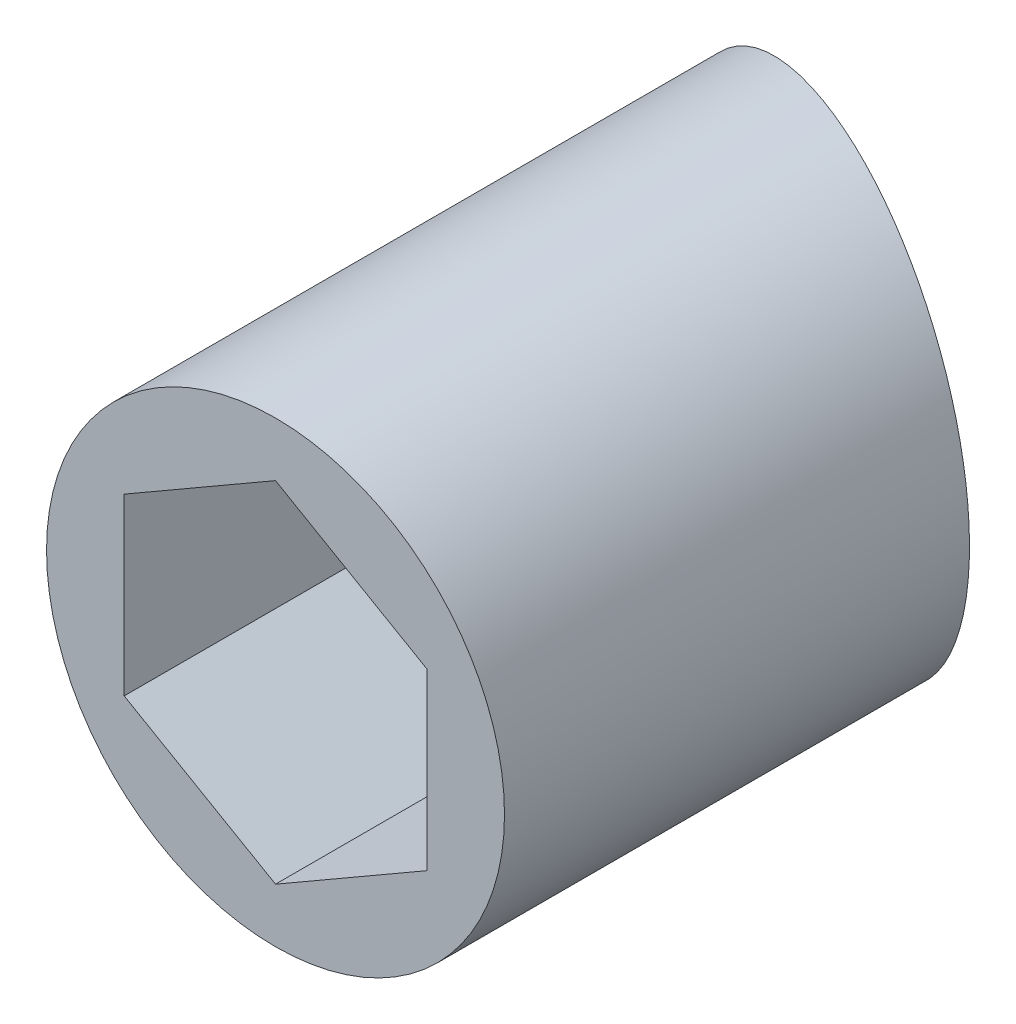
ISO-10303-21;
HEADER;
FILE_DESCRIPTION(('STEP AP214'),'2;1');
FILE_NAME('part.step','',(''),(''),'','','');
FILE_SCHEMA(('AUTOMOTIVE_DESIGN { 1 0 10303 214 1 1 1 1 }'));
ENDSEC;
DATA;
#1=APPLICATION_CONTEXT('core data for automotive mechanical design processes');
#2=APPLICATION_PROTOCOL_DEFINITION('international standard','automotive_design',2000,#1);
#3=PRODUCT_CONTEXT('',#1,'mechanical');
#4=PRODUCT('Part','Part','',(#3));
#5=PRODUCT_RELATED_PRODUCT_CATEGORY('part','',(#4));
#6=PRODUCT_DEFINITION_FORMATION('','',#4);
#7=PRODUCT_DEFINITION_CONTEXT('part definition',#1,'design');
#8=PRODUCT_DEFINITION('design','',#6,#7);
#9=PRODUCT_DEFINITION_SHAPE('','',#8);
#10=(LENGTH_UNIT() NAMED_UNIT(*) SI_UNIT(.MILLI.,.METRE.));
#11=(NAMED_UNIT(*) PLANE_ANGLE_UNIT() SI_UNIT($,.RADIAN.));
#12=(NAMED_UNIT(*) SI_UNIT($,.STERADIAN.) SOLID_ANGLE_UNIT());
#13=UNCERTAINTY_MEASURE_WITH_UNIT(LENGTH_MEASURE(1.E-05),#10,'distance_accuracy_value','');
#14=(GEOMETRIC_REPRESENTATION_CONTEXT(3) GLOBAL_UNCERTAINTY_ASSIGNED_CONTEXT((#13)) GLOBAL_UNIT_ASSIGNED_CONTEXT((#10,
#11,#12)) REPRESENTATION_CONTEXT('',''));
#15=CARTESIAN_POINT('',(0.,0.,0.));
#16=DIRECTION('',(0.,0.,1.));
#17=DIRECTION('',(1.,0.,0.));
#18=AXIS2_PLACEMENT_3D('',#15,#16,#17);
#19=CARTESIAN_POINT('',(0.,0.,12.));
#20=DIRECTION('',(0.,0.,-1.));
#21=DIRECTION('',(-1.,0.,0.));
#22=AXIS2_PLACEMENT_3D('',#19,#20,#21);
#23=CYLINDRICAL_SURFACE('',#22,4.35);
#24=CARTESIAN_POINT('',(0.,0.,12.));
#25=DIRECTION('',(0.,0.,1.));
#26=DIRECTION('',(1.,0.,0.));
#27=AXIS2_PLACEMENT_3D('',#24,#25,#26);
#28=CIRCLE('',#27,4.35);
#29=CARTESIAN_POINT('',(4.35,0.,12.));
#30=VERTEX_POINT('',#29);
#31=EDGE_CURVE('E11',#30,#30,#28,.T.);
#32=ORIENTED_EDGE('',*,*,#31,.F.);
#33=EDGE_LOOP('',(#32));
#34=FACE_BOUND('',#33,.T.);
#35=CARTESIAN_POINT('',(0.,0.,1.58327051905795));
#36=DIRECTION('',(0.342020143325663,0.,-0.939692620785911));
#37=DIRECTION('',(-0.939692620785911,0.,-0.342020143325663));
#38=AXIS2_PLACEMENT_3D('',#35,#36,#37);
#39=ELLIPSE('',#38,4.62917331027021,4.35);
#40=CARTESIAN_POINT('',(-4.35,0.,0.));
#41=VERTEX_POINT('',#40);
#42=EDGE_CURVE('E123',#41,#41,#39,.F.);
#43=ORIENTED_EDGE('',*,*,#42,.T.);
#44=EDGE_LOOP('',(#43));
#45=FACE_BOUND('',#44,.T.);
#46=ADVANCED_FACE('F35',(#34,#45),#23,.T.);
#47=CARTESIAN_POINT('',(0.,0.,12.));
#48=DIRECTION('',(0.,0.,1.));
#49=DIRECTION('',(1.,0.,0.));
#50=AXIS2_PLACEMENT_3D('',#47,#48,#49);
#51=PLANE('',#50);
#52=DIRECTION('',(-0.866025403784439,0.5,0.));
#53=VECTOR('',#52,1.);
#54=CARTESIAN_POINT('',(2.875,1.65988202392018,12.));
#55=LINE('',#54,#53);
#56=CARTESIAN_POINT('',(2.875,1.65988202392018,12.));
#57=VERTEX_POINT('',#56);
#58=CARTESIAN_POINT('',(0.,3.31976404784035,12.));
#59=VERTEX_POINT('',#58);
#60=EDGE_CURVE('E49',#57,#59,#55,.T.);
#61=ORIENTED_EDGE('',*,*,#60,.F.);
#62=DIRECTION('',(0.,1.,0.));
#63=VECTOR('',#62,1.);
#64=CARTESIAN_POINT('',(2.875,-1.65988202392018,12.));
#65=LINE('',#64,#63);
#66=CARTESIAN_POINT('',(2.875,-1.65988202392018,12.));
#67=VERTEX_POINT('',#66);
#68=EDGE_CURVE('E132',#67,#57,#65,.T.);
#69=ORIENTED_EDGE('',*,*,#68,.F.);
#70=DIRECTION('',(0.866025403784439,0.5,0.));
#71=VECTOR('',#70,1.);
#72=CARTESIAN_POINT('',(0.,-3.31976404784035,12.));
#73=LINE('',#72,#71);
#74=CARTESIAN_POINT('',(0.,-3.31976404784035,12.));
#75=VERTEX_POINT('',#74);
#76=EDGE_CURVE('E130',#75,#67,#73,.T.);
#77=ORIENTED_EDGE('',*,*,#76,.F.);
#78=DIRECTION('',(0.866025403784439,-0.5,0.));
#79=VECTOR('',#78,1.);
#80=CARTESIAN_POINT('',(-2.875,-1.65988202392017,12.));
#81=LINE('',#80,#79);
#82=CARTESIAN_POINT('',(-2.875,-1.65988202392017,12.));
#83=VERTEX_POINT('',#82);
#84=EDGE_CURVE('E96',#83,#75,#81,.T.);
#85=ORIENTED_EDGE('',*,*,#84,.F.);
#86=DIRECTION('',(0.,-1.,0.));
#87=VECTOR('',#86,1.);
#88=CARTESIAN_POINT('',(-2.875,1.65988202392018,12.));
#89=LINE('',#88,#87);
#90=CARTESIAN_POINT('',(-2.875,1.65988202392018,12.));
#91=VERTEX_POINT('',#90);
#92=EDGE_CURVE('E126',#91,#83,#89,.T.);
#93=ORIENTED_EDGE('',*,*,#92,.F.);
#94=DIRECTION('',(-0.866025403784439,-0.5,0.));
#95=VECTOR('',#94,1.);
#96=CARTESIAN_POINT('',(0.,3.31976404784035,12.));
#97=LINE('',#96,#95);
#98=EDGE_CURVE('E122',#59,#91,#97,.T.);
#99=ORIENTED_EDGE('',*,*,#98,.F.);
#100=EDGE_LOOP('',(#61,#69,#77,#85,#93,#99));
#101=FACE_BOUND('',#100,.T.);
#102=ORIENTED_EDGE('',*,*,#31,.T.);
#103=EDGE_LOOP('',(#102));
#104=FACE_BOUND('',#103,.T.);
#105=ADVANCED_FACE('F144',(#101,#104),#51,.T.);
#106=CARTESIAN_POINT('',(2.875,1.65988202392018,3.));
#107=DIRECTION('',(0.5,0.866025403784439,0.));
#108=DIRECTION('',(-0.866025403784439,0.5,0.));
#109=AXIS2_PLACEMENT_3D('',#106,#107,#108);
#110=PLANE('',#109);
#111=ORIENTED_EDGE('',*,*,#60,.T.);
#112=DIRECTION('',(0.,0.,1.));
#113=VECTOR('',#112,1.);
#114=CARTESIAN_POINT('',(0.,3.31976404784035,3.));
#115=LINE('',#114,#113);
#116=CARTESIAN_POINT('',(0.,3.31976404784035,3.));
#117=VERTEX_POINT('',#116);
#118=EDGE_CURVE('E78',#117,#59,#115,.T.);
#119=ORIENTED_EDGE('',*,*,#118,.F.);
#120=DIRECTION('',(-0.866025403784439,0.5,0.));
#121=VECTOR('',#120,1.);
#122=CARTESIAN_POINT('',(2.875,1.65988202392018,3.));
#123=LINE('',#122,#121);
#124=CARTESIAN_POINT('',(2.875,1.65988202392018,3.));
#125=VERTEX_POINT('',#124);
#126=EDGE_CURVE('E134',#125,#117,#123,.T.);
#127=ORIENTED_EDGE('',*,*,#126,.F.);
#128=DIRECTION('',(0.,0.,1.));
#129=VECTOR('',#128,1.);
#130=CARTESIAN_POINT('',(2.875,1.65988202392018,3.));
#131=LINE('',#130,#129);
#132=EDGE_CURVE('E42',#125,#57,#131,.T.);
#133=ORIENTED_EDGE('',*,*,#132,.T.);
#134=EDGE_LOOP('',(#111,#119,#127,#133));
#135=FACE_BOUND('',#134,.T.);
#136=ADVANCED_FACE('F167',(#135),#110,.F.);
#137=CARTESIAN_POINT('',(2.875,-1.65988202392018,3.));
#138=DIRECTION('',(1.,0.,0.));
#139=DIRECTION('',(0.,0.,-1.));
#140=AXIS2_PLACEMENT_3D('',#137,#138,#139);
#141=PLANE('',#140);
#142=ORIENTED_EDGE('',*,*,#68,.T.);
#143=ORIENTED_EDGE('',*,*,#132,.F.);
#144=DIRECTION('',(0.,1.,0.));
#145=VECTOR('',#144,1.);
#146=CARTESIAN_POINT('',(2.875,-1.65988202392018,3.));
#147=LINE('',#146,#145);
#148=CARTESIAN_POINT('',(2.875,-1.65988202392018,3.));
#149=VERTEX_POINT('',#148);
#150=EDGE_CURVE('E108',#149,#125,#147,.T.);
#151=ORIENTED_EDGE('',*,*,#150,.F.);
#152=DIRECTION('',(0.,0.,1.));
#153=VECTOR('',#152,1.);
#154=CARTESIAN_POINT('',(2.875,-1.65988202392018,3.));
#155=LINE('',#154,#153);
#156=EDGE_CURVE('E100',#149,#67,#155,.T.);
#157=ORIENTED_EDGE('',*,*,#156,.T.);
#158=EDGE_LOOP('',(#142,#143,#151,#157));
#159=FACE_BOUND('',#158,.T.);
#160=ADVANCED_FACE('F172',(#159),#141,.F.);
#161=CARTESIAN_POINT('',(0.,-3.31976404784035,3.));
#162=DIRECTION('',(0.5,-0.866025403784439,0.));
#163=DIRECTION('',(0.866025403784439,0.5,0.));
#164=AXIS2_PLACEMENT_3D('',#161,#162,#163);
#165=PLANE('',#164);
#166=ORIENTED_EDGE('',*,*,#76,.T.);
#167=ORIENTED_EDGE('',*,*,#156,.F.);
#168=DIRECTION('',(0.866025403784439,0.5,0.));
#169=VECTOR('',#168,1.);
#170=CARTESIAN_POINT('',(0.,-3.31976404784035,3.));
#171=LINE('',#170,#169);
#172=CARTESIAN_POINT('',(0.,-3.31976404784035,3.));
#173=VERTEX_POINT('',#172);
#174=EDGE_CURVE('E104',#173,#149,#171,.T.);
#175=ORIENTED_EDGE('',*,*,#174,.F.);
#176=DIRECTION('',(0.,0.,1.));
#177=VECTOR('',#176,1.);
#178=CARTESIAN_POINT('',(0.,-3.31976404784035,3.));
#179=LINE('',#178,#177);
#180=EDGE_CURVE('E89',#173,#75,#179,.T.);
#181=ORIENTED_EDGE('',*,*,#180,.T.);
#182=EDGE_LOOP('',(#166,#167,#175,#181));
#183=FACE_BOUND('',#182,.T.);
#184=ADVANCED_FACE('F105',(#183),#165,.F.);
#185=CARTESIAN_POINT('',(-2.875,-1.65988202392017,3.));
#186=DIRECTION('',(-0.5,-0.866025403784439,0.));
#187=DIRECTION('',(0.866025403784439,-0.5,0.));
#188=AXIS2_PLACEMENT_3D('',#185,#186,#187);
#189=PLANE('',#188);
#190=ORIENTED_EDGE('',*,*,#84,.T.);
#191=ORIENTED_EDGE('',*,*,#180,.F.);
#192=DIRECTION('',(0.866025403784439,-0.5,0.));
#193=VECTOR('',#192,1.);
#194=CARTESIAN_POINT('',(-2.875,-1.65988202392017,3.));
#195=LINE('',#194,#193);
#196=CARTESIAN_POINT('',(-2.875,-1.65988202392017,3.));
#197=VERTEX_POINT('',#196);
#198=EDGE_CURVE('E93',#197,#173,#195,.T.);
#199=ORIENTED_EDGE('',*,*,#198,.F.);
#200=DIRECTION('',(0.,0.,1.));
#201=VECTOR('',#200,1.);
#202=CARTESIAN_POINT('',(-2.875,-1.65988202392017,3.));
#203=LINE('',#202,#201);
#204=EDGE_CURVE('E101',#197,#83,#203,.T.);
#205=ORIENTED_EDGE('',*,*,#204,.T.);
#206=EDGE_LOOP('',(#190,#191,#199,#205));
#207=FACE_BOUND('',#206,.T.);
#208=ADVANCED_FACE('F91',(#207),#189,.F.);
#209=CARTESIAN_POINT('',(-2.875,1.65988202392018,3.));
#210=DIRECTION('',(-1.,0.,0.));
#211=DIRECTION('',(0.,-1.,0.));
#212=AXIS2_PLACEMENT_3D('',#209,#210,#211);
#213=PLANE('',#212);
#214=ORIENTED_EDGE('',*,*,#92,.T.);
#215=ORIENTED_EDGE('',*,*,#204,.F.);
#216=DIRECTION('',(0.,-1.,0.));
#217=VECTOR('',#216,1.);
#218=CARTESIAN_POINT('',(-2.875,1.65988202392018,3.));
#219=LINE('',#218,#217);
#220=CARTESIAN_POINT('',(-2.875,1.65988202392018,3.));
#221=VERTEX_POINT('',#220);
#222=EDGE_CURVE('E114',#221,#197,#219,.T.);
#223=ORIENTED_EDGE('',*,*,#222,.F.);
#224=DIRECTION('',(0.,0.,1.));
#225=VECTOR('',#224,1.);
#226=CARTESIAN_POINT('',(-2.875,1.65988202392018,3.));
#227=LINE('',#226,#225);
#228=EDGE_CURVE('E138',#221,#91,#227,.T.);
#229=ORIENTED_EDGE('',*,*,#228,.T.);
#230=EDGE_LOOP('',(#214,#215,#223,#229));
#231=FACE_BOUND('',#230,.T.);
#232=ADVANCED_FACE('F148',(#231),#213,.F.);
#233=CARTESIAN_POINT('',(0.,3.31976404784035,3.));
#234=DIRECTION('',(-0.5,0.866025403784439,0.));
#235=DIRECTION('',(-0.866025403784439,-0.5,0.));
#236=AXIS2_PLACEMENT_3D('',#233,#234,#235);
#237=PLANE('',#236);
#238=ORIENTED_EDGE('',*,*,#98,.T.);
#239=ORIENTED_EDGE('',*,*,#228,.F.);
#240=DIRECTION('',(-0.866025403784439,-0.5,0.));
#241=VECTOR('',#240,1.);
#242=CARTESIAN_POINT('',(0.,3.31976404784035,3.));
#243=LINE('',#242,#241);
#244=EDGE_CURVE('E116',#117,#221,#243,.T.);
#245=ORIENTED_EDGE('',*,*,#244,.F.);
#246=ORIENTED_EDGE('',*,*,#118,.T.);
#247=EDGE_LOOP('',(#238,#239,#245,#246));
#248=FACE_BOUND('',#247,.T.);
#249=ADVANCED_FACE('F141',(#248),#237,.F.);
#250=CARTESIAN_POINT('',(0.,0.,3.));
#251=DIRECTION('',(0.,0.,1.));
#252=DIRECTION('',(1.,0.,0.));
#253=AXIS2_PLACEMENT_3D('',#250,#251,#252);
#254=PLANE('',#253);
#255=ORIENTED_EDGE('',*,*,#126,.T.);
#256=ORIENTED_EDGE('',*,*,#244,.T.);
#257=ORIENTED_EDGE('',*,*,#222,.T.);
#258=ORIENTED_EDGE('',*,*,#198,.T.);
#259=ORIENTED_EDGE('',*,*,#174,.T.);
#260=ORIENTED_EDGE('',*,*,#150,.T.);
#261=EDGE_LOOP('',(#255,#256,#257,#258,#259,#260));
#262=FACE_BOUND('',#261,.T.);
#263=ADVANCED_FACE('F111',(#262),#254,.T.);
#264=CARTESIAN_POINT('',(-4.35,4.351,0.));
#265=DIRECTION('',(0.342020143325663,0.,-0.939692620785911));
#266=DIRECTION('',(-0.939692620785911,0.,-0.342020143325663));
#267=AXIS2_PLACEMENT_3D('',#264,#265,#266);
#268=PLANE('',#267);
#269=ORIENTED_EDGE('',*,*,#42,.F.);
#270=EDGE_LOOP('',(#269));
#271=FACE_BOUND('',#270,.T.);
#272=ADVANCED_FACE('F155',(#271),#268,.T.);
#273=CLOSED_SHELL('',(#46,#105,#136,#160,#184,#208,#232,#249,#263,#272));
#274=MANIFOLD_SOLID_BREP('B2',#273);
#275=ADVANCED_BREP_SHAPE_REPRESENTATION('',(#18,#274),#14);
#276=SHAPE_DEFINITION_REPRESENTATION(#9,#275);
ENDSEC;
END-ISO-10303-21;
